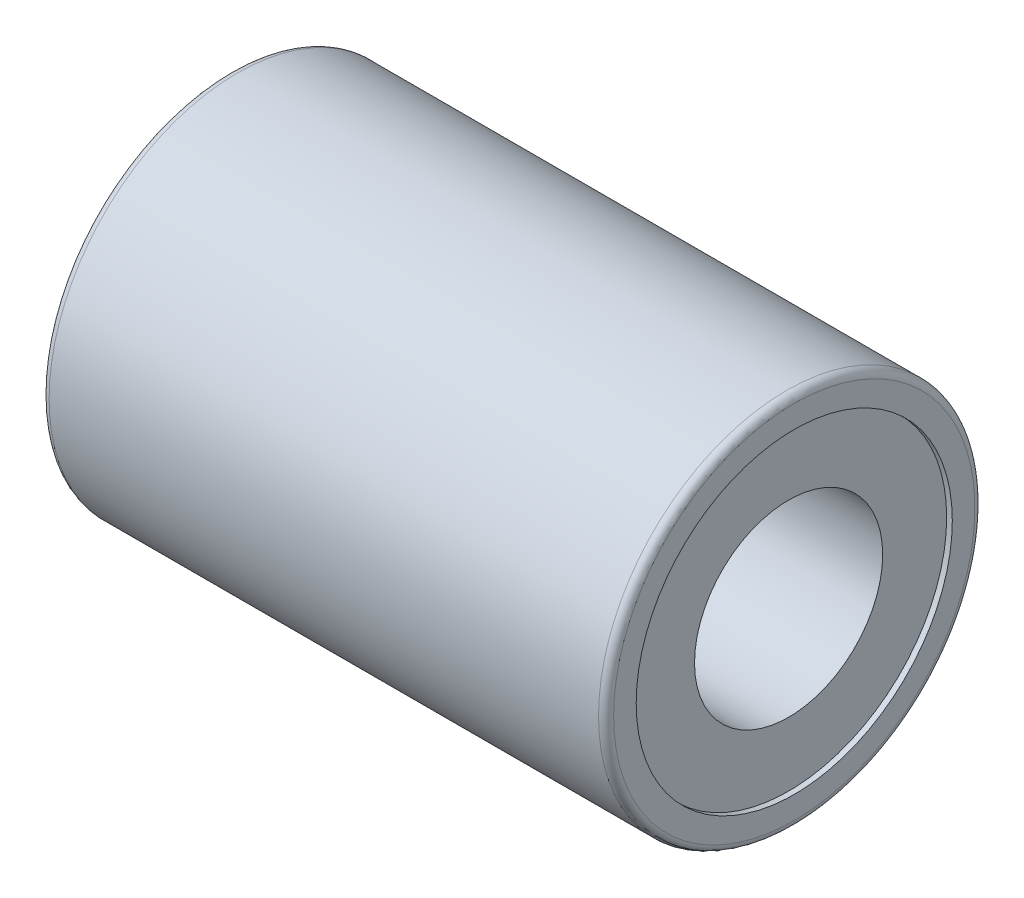
ISO-10303-21;
HEADER;
FILE_DESCRIPTION(('STEP AP214'),'2;1');
FILE_NAME('part.step','',(''),(''),'','','');
FILE_SCHEMA(('AUTOMOTIVE_DESIGN { 1 0 10303 214 1 1 1 1 }'));
ENDSEC;
DATA;
#1=APPLICATION_CONTEXT('core data for automotive mechanical design processes');
#2=APPLICATION_PROTOCOL_DEFINITION('international standard','automotive_design',2000,#1);
#3=PRODUCT_CONTEXT('',#1,'mechanical');
#4=PRODUCT('Part','Part','',(#3));
#5=PRODUCT_RELATED_PRODUCT_CATEGORY('part','',(#4));
#6=PRODUCT_DEFINITION_FORMATION('','',#4);
#7=PRODUCT_DEFINITION_CONTEXT('part definition',#1,'design');
#8=PRODUCT_DEFINITION('design','',#6,#7);
#9=PRODUCT_DEFINITION_SHAPE('','',#8);
#10=(LENGTH_UNIT() NAMED_UNIT(*) SI_UNIT(.MILLI.,.METRE.));
#11=(NAMED_UNIT(*) PLANE_ANGLE_UNIT() SI_UNIT($,.RADIAN.));
#12=(NAMED_UNIT(*) SI_UNIT($,.STERADIAN.) SOLID_ANGLE_UNIT());
#13=UNCERTAINTY_MEASURE_WITH_UNIT(LENGTH_MEASURE(1.E-05),#10,'distance_accuracy_value','');
#14=(GEOMETRIC_REPRESENTATION_CONTEXT(3) GLOBAL_UNCERTAINTY_ASSIGNED_CONTEXT((#13)) GLOBAL_UNIT_ASSIGNED_CONTEXT((#10,
#11,#12)) REPRESENTATION_CONTEXT('',''));
#15=CARTESIAN_POINT('',(0.,0.,0.));
#16=DIRECTION('',(0.,0.,1.));
#17=DIRECTION('',(1.,0.,0.));
#18=AXIS2_PLACEMENT_3D('',#15,#16,#17);
#19=CARTESIAN_POINT('',(-5.84,0.,0.));
#20=DIRECTION('',(-1.,0.,0.));
#21=DIRECTION('',(0.,0.,1.));
#22=AXIS2_PLACEMENT_3D('',#19,#20,#21);
#23=TOROIDAL_SURFACE('',#22,3.84,0.16);
#24=CARTESIAN_POINT('',(-5.84,0.,0.));
#25=DIRECTION('',(-1.,0.,0.));
#26=DIRECTION('',(0.,0.,1.));
#27=AXIS2_PLACEMENT_3D('',#24,#25,#26);
#28=CIRCLE('',#27,4.);
#29=CARTESIAN_POINT('',(-5.84,0.,4.));
#30=VERTEX_POINT('',#29);
#31=EDGE_CURVE('E10',#30,#30,#28,.T.);
#32=ORIENTED_EDGE('',*,*,#31,.T.);
#33=EDGE_LOOP('',(#32));
#34=FACE_BOUND('',#33,.T.);
#35=CARTESIAN_POINT('',(-6.,0.,0.));
#36=DIRECTION('',(-1.,0.,0.));
#37=DIRECTION('',(0.,0.,1.));
#38=AXIS2_PLACEMENT_3D('',#35,#36,#37);
#39=CIRCLE('',#38,3.84);
#40=CARTESIAN_POINT('',(-6.,0.,3.84));
#41=VERTEX_POINT('',#40);
#42=EDGE_CURVE('E69',#41,#41,#39,.T.);
#43=ORIENTED_EDGE('',*,*,#42,.F.);
#44=EDGE_LOOP('',(#43));
#45=FACE_BOUND('',#44,.T.);
#46=ADVANCED_FACE('F35',(#34,#45),#23,.T.);
#47=CARTESIAN_POINT('',(6.,0.,0.));
#48=DIRECTION('',(-1.,0.,0.));
#49=DIRECTION('',(0.,0.,1.));
#50=AXIS2_PLACEMENT_3D('',#47,#48,#49);
#51=CYLINDRICAL_SURFACE('',#50,4.);
#52=CARTESIAN_POINT('',(5.84,0.,0.));
#53=DIRECTION('',(-1.,0.,0.));
#54=DIRECTION('',(0.,0.,1.));
#55=AXIS2_PLACEMENT_3D('',#52,#53,#54);
#56=CIRCLE('',#55,4.);
#57=CARTESIAN_POINT('',(5.84,0.,4.));
#58=VERTEX_POINT('',#57);
#59=EDGE_CURVE('E41',#58,#58,#56,.T.);
#60=ORIENTED_EDGE('',*,*,#59,.T.);
#61=EDGE_LOOP('',(#60));
#62=FACE_BOUND('',#61,.T.);
#63=ORIENTED_EDGE('',*,*,#31,.F.);
#64=EDGE_LOOP('',(#63));
#65=FACE_BOUND('',#64,.T.);
#66=ADVANCED_FACE('F77',(#62,#65),#51,.T.);
#67=CARTESIAN_POINT('',(5.84,0.,0.));
#68=DIRECTION('',(-1.,0.,0.));
#69=DIRECTION('',(0.,0.,1.));
#70=AXIS2_PLACEMENT_3D('',#67,#68,#69);
#71=TOROIDAL_SURFACE('',#70,3.84,0.16);
#72=CARTESIAN_POINT('',(6.,0.,0.));
#73=DIRECTION('',(-1.,0.,0.));
#74=DIRECTION('',(0.,0.,1.));
#75=AXIS2_PLACEMENT_3D('',#72,#73,#74);
#76=CIRCLE('',#75,3.84);
#77=CARTESIAN_POINT('',(6.,0.,3.84));
#78=VERTEX_POINT('',#77);
#79=EDGE_CURVE('E45',#78,#78,#76,.T.);
#80=ORIENTED_EDGE('',*,*,#79,.T.);
#81=EDGE_LOOP('',(#80));
#82=FACE_BOUND('',#81,.T.);
#83=ORIENTED_EDGE('',*,*,#59,.F.);
#84=EDGE_LOOP('',(#83));
#85=FACE_BOUND('',#84,.T.);
#86=ADVANCED_FACE('F81',(#82,#85),#71,.T.);
#87=CARTESIAN_POINT('',(6.,3.84,0.));
#88=DIRECTION('',(1.,0.,0.));
#89=DIRECTION('',(0.,0.,-1.));
#90=AXIS2_PLACEMENT_3D('',#87,#88,#89);
#91=PLANE('',#90);
#92=CARTESIAN_POINT('',(6.,0.,0.));
#93=DIRECTION('',(-1.,0.,0.));
#94=DIRECTION('',(0.,0.,1.));
#95=AXIS2_PLACEMENT_3D('',#92,#93,#94);
#96=CIRCLE('',#95,3.36);
#97=CARTESIAN_POINT('',(6.,0.,3.36));
#98=VERTEX_POINT('',#97);
#99=EDGE_CURVE('E49',#98,#98,#96,.T.);
#100=ORIENTED_EDGE('',*,*,#99,.T.);
#101=EDGE_LOOP('',(#100));
#102=FACE_BOUND('',#101,.T.);
#103=ORIENTED_EDGE('',*,*,#79,.F.);
#104=EDGE_LOOP('',(#103));
#105=FACE_BOUND('',#104,.T.);
#106=ADVANCED_FACE('F85',(#102,#105),#91,.T.);
#107=CARTESIAN_POINT('',(6.,0.,0.));
#108=DIRECTION('',(-1.,0.,0.));
#109=DIRECTION('',(0.,0.,1.));
#110=AXIS2_PLACEMENT_3D('',#107,#108,#109);
#111=CYLINDRICAL_SURFACE('',#110,3.36);
#112=CARTESIAN_POINT('',(5.88,0.,0.));
#113=DIRECTION('',(-1.,0.,0.));
#114=DIRECTION('',(0.,0.,1.));
#115=AXIS2_PLACEMENT_3D('',#112,#113,#114);
#116=CIRCLE('',#115,3.36);
#117=CARTESIAN_POINT('',(5.88,0.,3.36));
#118=VERTEX_POINT('',#117);
#119=EDGE_CURVE('E54',#118,#118,#116,.T.);
#120=ORIENTED_EDGE('',*,*,#119,.T.);
#121=EDGE_LOOP('',(#120));
#122=FACE_BOUND('',#121,.T.);
#123=ORIENTED_EDGE('',*,*,#99,.F.);
#124=EDGE_LOOP('',(#123));
#125=FACE_BOUND('',#124,.T.);
#126=ADVANCED_FACE('F92',(#122,#125),#111,.F.);
#127=CARTESIAN_POINT('',(5.88,3.36,0.));
#128=DIRECTION('',(1.,0.,0.));
#129=DIRECTION('',(0.,0.,-1.));
#130=AXIS2_PLACEMENT_3D('',#127,#128,#129);
#131=PLANE('',#130);
#132=CARTESIAN_POINT('',(5.88,0.,0.));
#133=DIRECTION('',(-1.,0.,0.));
#134=DIRECTION('',(0.,0.,1.));
#135=AXIS2_PLACEMENT_3D('',#132,#133,#134);
#136=CIRCLE('',#135,2.);
#137=CARTESIAN_POINT('',(5.88,0.,2.));
#138=VERTEX_POINT('',#137);
#139=EDGE_CURVE('E57',#138,#138,#136,.T.);
#140=ORIENTED_EDGE('',*,*,#139,.T.);
#141=EDGE_LOOP('',(#140));
#142=FACE_BOUND('',#141,.T.);
#143=ORIENTED_EDGE('',*,*,#119,.F.);
#144=EDGE_LOOP('',(#143));
#145=FACE_BOUND('',#144,.T.);
#146=ADVANCED_FACE('F96',(#142,#145),#131,.T.);
#147=CARTESIAN_POINT('',(6.,0.,0.));
#148=DIRECTION('',(-1.,0.,0.));
#149=DIRECTION('',(0.,0.,1.));
#150=AXIS2_PLACEMENT_3D('',#147,#148,#149);
#151=CYLINDRICAL_SURFACE('',#150,2.);
#152=CARTESIAN_POINT('',(-5.88,0.,0.));
#153=DIRECTION('',(-1.,0.,0.));
#154=DIRECTION('',(0.,0.,1.));
#155=AXIS2_PLACEMENT_3D('',#152,#153,#154);
#156=CIRCLE('',#155,2.);
#157=CARTESIAN_POINT('',(-5.88,0.,2.));
#158=VERTEX_POINT('',#157);
#159=EDGE_CURVE('E60',#158,#158,#156,.T.);
#160=ORIENTED_EDGE('',*,*,#159,.T.);
#161=EDGE_LOOP('',(#160));
#162=FACE_BOUND('',#161,.T.);
#163=ORIENTED_EDGE('',*,*,#139,.F.);
#164=EDGE_LOOP('',(#163));
#165=FACE_BOUND('',#164,.T.);
#166=ADVANCED_FACE('F100',(#162,#165),#151,.F.);
#167=CARTESIAN_POINT('',(-5.88,2.,0.));
#168=DIRECTION('',(-1.,0.,0.));
#169=DIRECTION('',(0.,0.,1.));
#170=AXIS2_PLACEMENT_3D('',#167,#168,#169);
#171=PLANE('',#170);
#172=CARTESIAN_POINT('',(-5.88,0.,0.));
#173=DIRECTION('',(-1.,0.,0.));
#174=DIRECTION('',(0.,0.,1.));
#175=AXIS2_PLACEMENT_3D('',#172,#173,#174);
#176=CIRCLE('',#175,3.36);
#177=CARTESIAN_POINT('',(-5.88,0.,3.36));
#178=VERTEX_POINT('',#177);
#179=EDGE_CURVE('E63',#178,#178,#176,.T.);
#180=ORIENTED_EDGE('',*,*,#179,.T.);
#181=EDGE_LOOP('',(#180));
#182=FACE_BOUND('',#181,.T.);
#183=ORIENTED_EDGE('',*,*,#159,.F.);
#184=EDGE_LOOP('',(#183));
#185=FACE_BOUND('',#184,.T.);
#186=ADVANCED_FACE('F104',(#182,#185),#171,.T.);
#187=CARTESIAN_POINT('',(6.,0.,0.));
#188=DIRECTION('',(-1.,0.,0.));
#189=DIRECTION('',(0.,0.,1.));
#190=AXIS2_PLACEMENT_3D('',#187,#188,#189);
#191=CYLINDRICAL_SURFACE('',#190,3.36);
#192=CARTESIAN_POINT('',(-6.,0.,0.));
#193=DIRECTION('',(-1.,0.,0.));
#194=DIRECTION('',(0.,0.,1.));
#195=AXIS2_PLACEMENT_3D('',#192,#193,#194);
#196=CIRCLE('',#195,3.36);
#197=CARTESIAN_POINT('',(-6.,0.,3.36));
#198=VERTEX_POINT('',#197);
#199=EDGE_CURVE('E66',#198,#198,#196,.T.);
#200=ORIENTED_EDGE('',*,*,#199,.T.);
#201=EDGE_LOOP('',(#200));
#202=FACE_BOUND('',#201,.T.);
#203=ORIENTED_EDGE('',*,*,#179,.F.);
#204=EDGE_LOOP('',(#203));
#205=FACE_BOUND('',#204,.T.);
#206=ADVANCED_FACE('F108',(#202,#205),#191,.F.);
#207=CARTESIAN_POINT('',(-6.,3.36,0.));
#208=DIRECTION('',(-1.,0.,0.));
#209=DIRECTION('',(0.,0.,1.));
#210=AXIS2_PLACEMENT_3D('',#207,#208,#209);
#211=PLANE('',#210);
#212=ORIENTED_EDGE('',*,*,#42,.T.);
#213=EDGE_LOOP('',(#212));
#214=FACE_BOUND('',#213,.T.);
#215=ORIENTED_EDGE('',*,*,#199,.F.);
#216=EDGE_LOOP('',(#215));
#217=FACE_BOUND('',#216,.T.);
#218=ADVANCED_FACE('F73',(#214,#217),#211,.T.);
#219=CLOSED_SHELL('',(#46,#66,#86,#106,#126,#146,#166,#186,#206,#218));
#220=MANIFOLD_SOLID_BREP('B2',#219);
#221=ADVANCED_BREP_SHAPE_REPRESENTATION('',(#18,#220),#14);
#222=SHAPE_DEFINITION_REPRESENTATION(#9,#221);
ENDSEC;
END-ISO-10303-21;
